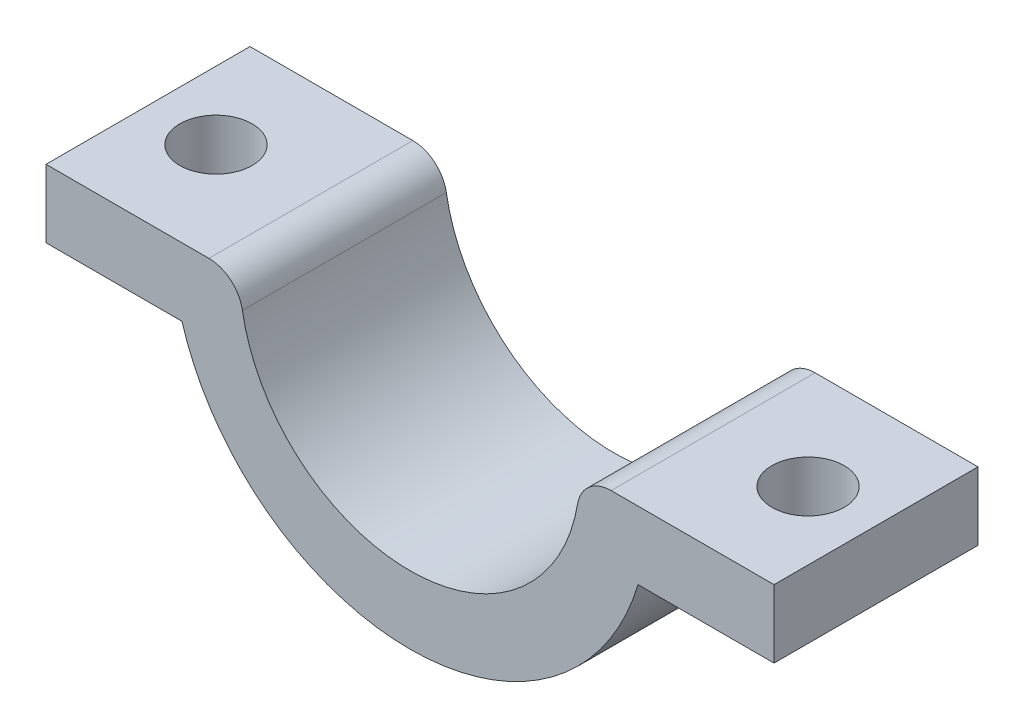
ISO-10303-21;
HEADER;
FILE_DESCRIPTION(('STEP AP214'),'2;1');
FILE_NAME('part.step','',(''),(''),'','','');
FILE_SCHEMA(('AUTOMOTIVE_DESIGN { 1 0 10303 214 1 1 1 1 }'));
ENDSEC;
DATA;
#1=APPLICATION_CONTEXT('core data for automotive mechanical design processes');
#2=APPLICATION_PROTOCOL_DEFINITION('international standard','automotive_design',2000,#1);
#3=PRODUCT_CONTEXT('',#1,'mechanical');
#4=PRODUCT('Part','Part','',(#3));
#5=PRODUCT_RELATED_PRODUCT_CATEGORY('part','',(#4));
#6=PRODUCT_DEFINITION_FORMATION('','',#4);
#7=PRODUCT_DEFINITION_CONTEXT('part definition',#1,'design');
#8=PRODUCT_DEFINITION('design','',#6,#7);
#9=PRODUCT_DEFINITION_SHAPE('','',#8);
#10=(LENGTH_UNIT() NAMED_UNIT(*) SI_UNIT(.MILLI.,.METRE.));
#11=(NAMED_UNIT(*) PLANE_ANGLE_UNIT() SI_UNIT($,.RADIAN.));
#12=(NAMED_UNIT(*) SI_UNIT($,.STERADIAN.) SOLID_ANGLE_UNIT());
#13=UNCERTAINTY_MEASURE_WITH_UNIT(LENGTH_MEASURE(1.E-05),#10,'distance_accuracy_value','');
#14=(GEOMETRIC_REPRESENTATION_CONTEXT(3) GLOBAL_UNCERTAINTY_ASSIGNED_CONTEXT((#13)) GLOBAL_UNIT_ASSIGNED_CONTEXT((#10,
#11,#12)) REPRESENTATION_CONTEXT('',''));
#15=CARTESIAN_POINT('',(0.,0.,0.));
#16=DIRECTION('',(0.,0.,1.));
#17=DIRECTION('',(1.,0.,0.));
#18=AXIS2_PLACEMENT_3D('',#15,#16,#17);
#19=CARTESIAN_POINT('',(0.,0.,19.05));
#20=DIRECTION('',(0.,0.,-1.));
#21=DIRECTION('',(-1.,0.,0.));
#22=AXIS2_PLACEMENT_3D('',#19,#20,#21);
#23=CYLINDRICAL_SURFACE('',#22,15.875);
#24=CARTESIAN_POINT('',(0.,0.,0.));
#25=DIRECTION('',(0.,0.,-1.));
#26=DIRECTION('',(-1.,0.,0.));
#27=AXIS2_PLACEMENT_3D('',#24,#25,#26);
#28=CIRCLE('',#27,15.875);
#29=CARTESIAN_POINT('',(15.6529610927844,-2.64583333333333,0.));
#30=VERTEX_POINT('',#29);
#31=CARTESIAN_POINT('',(-15.6529610927844,-2.64583333333333,0.));
#32=VERTEX_POINT('',#31);
#33=EDGE_CURVE('E150',#30,#32,#28,.T.);
#34=ORIENTED_EDGE('',*,*,#33,.T.);
#35=DIRECTION('',(0.,0.,-1.));
#36=VECTOR('',#35,1.);
#37=CARTESIAN_POINT('',(-15.6529610927844,-2.64583333333333,19.05));
#38=LINE('',#37,#36);
#39=CARTESIAN_POINT('',(-15.6529610927844,-2.64583333333333,19.05));
#40=VERTEX_POINT('',#39);
#41=EDGE_CURVE('E54',#32,#40,#38,.F.);
#42=ORIENTED_EDGE('',*,*,#41,.T.);
#43=CARTESIAN_POINT('',(0.,0.,19.05));
#44=DIRECTION('',(0.,0.,-1.));
#45=DIRECTION('',(-1.,0.,0.));
#46=AXIS2_PLACEMENT_3D('',#43,#44,#45);
#47=CIRCLE('',#46,15.875);
#48=CARTESIAN_POINT('',(15.6529610927844,-2.64583333333333,19.05));
#49=VERTEX_POINT('',#48);
#50=EDGE_CURVE('E121',#49,#40,#47,.T.);
#51=ORIENTED_EDGE('',*,*,#50,.F.);
#52=DIRECTION('',(0.,0.,-1.));
#53=VECTOR('',#52,1.);
#54=CARTESIAN_POINT('',(15.6529610927844,-2.64583333333333,19.05));
#55=LINE('',#54,#53);
#56=EDGE_CURVE('E183',#49,#30,#55,.T.);
#57=ORIENTED_EDGE('',*,*,#56,.T.);
#58=EDGE_LOOP('',(#34,#42,#51,#57));
#59=FACE_BOUND('',#58,.T.);
#60=ADVANCED_FACE('F33',(#59),#23,.F.);
#61=CARTESIAN_POINT('',(-15.875,0.,19.05));
#62=DIRECTION('',(0.,-1.,0.));
#63=DIRECTION('',(1.,0.,0.));
#64=AXIS2_PLACEMENT_3D('',#61,#62,#63);
#65=PLANE('',#64);
#66=CARTESIAN_POINT('',(-27.6485474856855,0.,9.525));
#67=DIRECTION('',(0.,-1.,0.));
#68=DIRECTION('',(0.,0.,-1.));
#69=AXIS2_PLACEMENT_3D('',#66,#67,#68);
#70=CIRCLE('',#69,3.3782);
#71=CARTESIAN_POINT('',(-27.6485474856855,0.,6.1468));
#72=VERTEX_POINT('',#71);
#73=EDGE_CURVE('E263',#72,#72,#70,.T.);
#74=ORIENTED_EDGE('',*,*,#73,.T.);
#75=EDGE_LOOP('',(#74));
#76=FACE_BOUND('',#75,.T.);
#77=DIRECTION('',(-1.,0.,0.));
#78=VECTOR('',#77,1.);
#79=CARTESIAN_POINT('',(-15.875,0.,19.05));
#80=LINE('',#79,#78);
#81=CARTESIAN_POINT('',(-18.7835533113413,0.,19.05));
#82=VERTEX_POINT('',#81);
#83=CARTESIAN_POINT('',(-33.9985474856855,0.,19.05));
#84=VERTEX_POINT('',#83);
#85=EDGE_CURVE('E111',#82,#84,#80,.T.);
#86=ORIENTED_EDGE('',*,*,#85,.F.);
#87=DIRECTION('',(0.,0.,-1.));
#88=VECTOR('',#87,1.);
#89=CARTESIAN_POINT('',(-18.7835533113413,0.,19.05));
#90=LINE('',#89,#88);
#91=CARTESIAN_POINT('',(-18.7835533113413,0.,0.));
#92=VERTEX_POINT('',#91);
#93=EDGE_CURVE('E130',#82,#92,#90,.T.);
#94=ORIENTED_EDGE('',*,*,#93,.T.);
#95=DIRECTION('',(-1.,0.,0.));
#96=VECTOR('',#95,1.);
#97=CARTESIAN_POINT('',(-15.875,0.,0.));
#98=LINE('',#97,#96);
#99=CARTESIAN_POINT('',(-33.9985474856855,0.,0.));
#100=VERTEX_POINT('',#99);
#101=EDGE_CURVE('E127',#92,#100,#98,.T.);
#102=ORIENTED_EDGE('',*,*,#101,.T.);
#103=DIRECTION('',(0.,0.,-1.));
#104=VECTOR('',#103,1.);
#105=CARTESIAN_POINT('',(-33.9985474856855,0.,19.05));
#106=LINE('',#105,#104);
#107=EDGE_CURVE('E124',#84,#100,#106,.T.);
#108=ORIENTED_EDGE('',*,*,#107,.F.);
#109=EDGE_LOOP('',(#86,#94,#102,#108));
#110=FACE_BOUND('',#109,.T.);
#111=ADVANCED_FACE('F125',(#76,#110),#65,.F.);
#112=CARTESIAN_POINT('',(-33.9985474856855,0.,19.05));
#113=DIRECTION('',(1.,0.,0.));
#114=DIRECTION('',(0.,0.,-1.));
#115=AXIS2_PLACEMENT_3D('',#112,#113,#114);
#116=PLANE('',#115);
#117=DIRECTION('',(0.,-1.,0.));
#118=VECTOR('',#117,1.);
#119=CARTESIAN_POINT('',(-33.9985474856855,0.,0.));
#120=LINE('',#119,#118);
#121=CARTESIAN_POINT('',(-33.9985474856855,-6.35,0.));
#122=VERTEX_POINT('',#121);
#123=EDGE_CURVE('E154',#100,#122,#120,.T.);
#124=ORIENTED_EDGE('',*,*,#123,.T.);
#125=DIRECTION('',(0.,0.,-1.));
#126=VECTOR('',#125,1.);
#127=CARTESIAN_POINT('',(-33.9985474856855,-6.35,19.05));
#128=LINE('',#127,#126);
#129=CARTESIAN_POINT('',(-33.9985474856855,-6.35,19.05));
#130=VERTEX_POINT('',#129);
#131=EDGE_CURVE('E131',#130,#122,#128,.T.);
#132=ORIENTED_EDGE('',*,*,#131,.F.);
#133=DIRECTION('',(0.,-1.,0.));
#134=VECTOR('',#133,1.);
#135=CARTESIAN_POINT('',(-33.9985474856855,0.,19.05));
#136=LINE('',#135,#134);
#137=EDGE_CURVE('E115',#84,#130,#136,.T.);
#138=ORIENTED_EDGE('',*,*,#137,.F.);
#139=ORIENTED_EDGE('',*,*,#107,.T.);
#140=EDGE_LOOP('',(#124,#132,#138,#139));
#141=FACE_BOUND('',#140,.T.);
#142=ADVANCED_FACE('F133',(#141),#116,.F.);
#143=CARTESIAN_POINT('',(-33.9985474856855,-6.35,19.05));
#144=DIRECTION('',(0.,1.,0.));
#145=DIRECTION('',(0.,0.,1.));
#146=AXIS2_PLACEMENT_3D('',#143,#144,#145);
#147=PLANE('',#146);
#148=CARTESIAN_POINT('',(-27.6485474856855,-6.35,9.525));
#149=DIRECTION('',(0.,-1.,0.));
#150=DIRECTION('',(0.,0.,-1.));
#151=AXIS2_PLACEMENT_3D('',#148,#149,#150);
#152=CIRCLE('',#151,3.3782);
#153=CARTESIAN_POINT('',(-27.6485474856855,-6.35,6.1468));
#154=VERTEX_POINT('',#153);
#155=EDGE_CURVE('E267',#154,#154,#152,.T.);
#156=ORIENTED_EDGE('',*,*,#155,.F.);
#157=EDGE_LOOP('',(#156));
#158=FACE_BOUND('',#157,.T.);
#159=DIRECTION('',(1.,0.,0.));
#160=VECTOR('',#159,1.);
#161=CARTESIAN_POINT('',(-33.9985474856855,-6.35,0.));
#162=LINE('',#161,#160);
#163=CARTESIAN_POINT('',(-21.2985474856855,-6.35,0.));
#164=VERTEX_POINT('',#163);
#165=EDGE_CURVE('E156',#122,#164,#162,.T.);
#166=ORIENTED_EDGE('',*,*,#165,.T.);
#167=DIRECTION('',(0.,0.,-1.));
#168=VECTOR('',#167,1.);
#169=CARTESIAN_POINT('',(-21.2985474856855,-6.35,19.05));
#170=LINE('',#169,#168);
#171=CARTESIAN_POINT('',(-21.2985474856855,-6.35,19.05));
#172=VERTEX_POINT('',#171);
#173=EDGE_CURVE('E174',#172,#164,#170,.T.);
#174=ORIENTED_EDGE('',*,*,#173,.F.);
#175=DIRECTION('',(1.,0.,0.));
#176=VECTOR('',#175,1.);
#177=CARTESIAN_POINT('',(-33.9985474856855,-6.35,19.05));
#178=LINE('',#177,#176);
#179=EDGE_CURVE('E136',#130,#172,#178,.T.);
#180=ORIENTED_EDGE('',*,*,#179,.F.);
#181=ORIENTED_EDGE('',*,*,#131,.T.);
#182=EDGE_LOOP('',(#166,#174,#180,#181));
#183=FACE_BOUND('',#182,.T.);
#184=ADVANCED_FACE('F214',(#158,#183),#147,.F.);
#185=CARTESIAN_POINT('',(0.,0.,19.05));
#186=DIRECTION('',(0.,0.,-1.));
#187=DIRECTION('',(-1.,0.,0.));
#188=AXIS2_PLACEMENT_3D('',#185,#186,#187);
#189=CYLINDRICAL_SURFACE('',#188,22.225);
#190=CARTESIAN_POINT('',(0.,0.,0.));
#191=DIRECTION('',(0.,0.,1.));
#192=DIRECTION('',(1.,0.,0.));
#193=AXIS2_PLACEMENT_3D('',#190,#191,#192);
#194=CIRCLE('',#193,22.225);
#195=CARTESIAN_POINT('',(21.2985474856855,-6.35000000000001,0.));
#196=VERTEX_POINT('',#195);
#197=EDGE_CURVE('E158',#164,#196,#194,.T.);
#198=ORIENTED_EDGE('',*,*,#197,.T.);
#199=DIRECTION('',(0.,0.,-1.));
#200=VECTOR('',#199,1.);
#201=CARTESIAN_POINT('',(21.2985474856855,-6.35000000000001,19.05));
#202=LINE('',#201,#200);
#203=CARTESIAN_POINT('',(21.2985474856855,-6.35000000000001,19.05));
#204=VERTEX_POINT('',#203);
#205=EDGE_CURVE('E171',#204,#196,#202,.T.);
#206=ORIENTED_EDGE('',*,*,#205,.F.);
#207=CARTESIAN_POINT('',(0.,0.,19.05));
#208=DIRECTION('',(0.,0.,1.));
#209=DIRECTION('',(1.,0.,0.));
#210=AXIS2_PLACEMENT_3D('',#207,#208,#209);
#211=CIRCLE('',#210,22.225);
#212=EDGE_CURVE('E138',#172,#204,#211,.T.);
#213=ORIENTED_EDGE('',*,*,#212,.F.);
#214=ORIENTED_EDGE('',*,*,#173,.T.);
#215=EDGE_LOOP('',(#198,#206,#213,#214));
#216=FACE_BOUND('',#215,.T.);
#217=ADVANCED_FACE('F211',(#216),#189,.T.);
#218=CARTESIAN_POINT('',(33.9985474856855,-6.35,19.05));
#219=DIRECTION('',(0.,1.,0.));
#220=DIRECTION('',(0.,0.,1.));
#221=AXIS2_PLACEMENT_3D('',#218,#219,#220);
#222=PLANE('',#221);
#223=CARTESIAN_POINT('',(27.6485474856855,-6.35,9.525));
#224=DIRECTION('',(0.,-1.,0.));
#225=DIRECTION('',(0.,0.,-1.));
#226=AXIS2_PLACEMENT_3D('',#223,#224,#225);
#227=CIRCLE('',#226,3.3782);
#228=CARTESIAN_POINT('',(27.6485474856855,-6.35,6.1468));
#229=VERTEX_POINT('',#228);
#230=EDGE_CURVE('E262',#229,#229,#227,.T.);
#231=ORIENTED_EDGE('',*,*,#230,.F.);
#232=EDGE_LOOP('',(#231));
#233=FACE_BOUND('',#232,.T.);
#234=DIRECTION('',(1.,0.,0.));
#235=VECTOR('',#234,1.);
#236=CARTESIAN_POINT('',(33.9985474856855,-6.35,0.));
#237=LINE('',#236,#235);
#238=CARTESIAN_POINT('',(33.9985474856855,-6.35,0.));
#239=VERTEX_POINT('',#238);
#240=EDGE_CURVE('E160',#196,#239,#237,.T.);
#241=ORIENTED_EDGE('',*,*,#240,.T.);
#242=DIRECTION('',(0.,0.,-1.));
#243=VECTOR('',#242,1.);
#244=CARTESIAN_POINT('',(33.9985474856855,-6.35,19.05));
#245=LINE('',#244,#243);
#246=CARTESIAN_POINT('',(33.9985474856855,-6.35,19.05));
#247=VERTEX_POINT('',#246);
#248=EDGE_CURVE('E168',#247,#239,#245,.T.);
#249=ORIENTED_EDGE('',*,*,#248,.F.);
#250=DIRECTION('',(1.,0.,0.));
#251=VECTOR('',#250,1.);
#252=CARTESIAN_POINT('',(33.9985474856855,-6.35,19.05));
#253=LINE('',#252,#251);
#254=EDGE_CURVE('E143',#204,#247,#253,.T.);
#255=ORIENTED_EDGE('',*,*,#254,.F.);
#256=ORIENTED_EDGE('',*,*,#205,.T.);
#257=EDGE_LOOP('',(#241,#249,#255,#256));
#258=FACE_BOUND('',#257,.T.);
#259=ADVANCED_FACE('F206',(#233,#258),#222,.F.);
#260=CARTESIAN_POINT('',(33.9985474856855,0.,19.05));
#261=DIRECTION('',(-1.,0.,0.));
#262=DIRECTION('',(0.,0.,1.));
#263=AXIS2_PLACEMENT_3D('',#260,#261,#262);
#264=PLANE('',#263);
#265=DIRECTION('',(0.,1.,0.));
#266=VECTOR('',#265,1.);
#267=CARTESIAN_POINT('',(33.9985474856855,0.,0.));
#268=LINE('',#267,#266);
#269=CARTESIAN_POINT('',(33.9985474856855,0.,0.));
#270=VERTEX_POINT('',#269);
#271=EDGE_CURVE('E162',#239,#270,#268,.T.);
#272=ORIENTED_EDGE('',*,*,#271,.T.);
#273=DIRECTION('',(0.,0.,-1.));
#274=VECTOR('',#273,1.);
#275=CARTESIAN_POINT('',(33.9985474856855,0.,19.05));
#276=LINE('',#275,#274);
#277=CARTESIAN_POINT('',(33.9985474856855,0.,19.05));
#278=VERTEX_POINT('',#277);
#279=EDGE_CURVE('E149',#278,#270,#276,.T.);
#280=ORIENTED_EDGE('',*,*,#279,.F.);
#281=DIRECTION('',(0.,1.,0.));
#282=VECTOR('',#281,1.);
#283=CARTESIAN_POINT('',(33.9985474856855,0.,19.05));
#284=LINE('',#283,#282);
#285=EDGE_CURVE('E145',#247,#278,#284,.T.);
#286=ORIENTED_EDGE('',*,*,#285,.F.);
#287=ORIENTED_EDGE('',*,*,#248,.T.);
#288=EDGE_LOOP('',(#272,#280,#286,#287));
#289=FACE_BOUND('',#288,.T.);
#290=ADVANCED_FACE('F200',(#289),#264,.F.);
#291=CARTESIAN_POINT('',(15.875,0.,19.05));
#292=DIRECTION('',(0.,-1.,0.));
#293=DIRECTION('',(1.,0.,0.));
#294=AXIS2_PLACEMENT_3D('',#291,#292,#293);
#295=PLANE('',#294);
#296=CARTESIAN_POINT('',(27.6485474856855,0.,9.525));
#297=DIRECTION('',(0.,-1.,0.));
#298=DIRECTION('',(0.,0.,-1.));
#299=AXIS2_PLACEMENT_3D('',#296,#297,#298);
#300=CIRCLE('',#299,3.3782);
#301=CARTESIAN_POINT('',(27.6485474856855,0.,6.1468));
#302=VERTEX_POINT('',#301);
#303=EDGE_CURVE('E152',#302,#302,#300,.T.);
#304=ORIENTED_EDGE('',*,*,#303,.T.);
#305=EDGE_LOOP('',(#304));
#306=FACE_BOUND('',#305,.T.);
#307=DIRECTION('',(-1.,0.,0.));
#308=VECTOR('',#307,1.);
#309=CARTESIAN_POINT('',(15.875,0.,0.));
#310=LINE('',#309,#308);
#311=CARTESIAN_POINT('',(18.7835533113413,0.,0.));
#312=VERTEX_POINT('',#311);
#313=EDGE_CURVE('E164',#270,#312,#310,.T.);
#314=ORIENTED_EDGE('',*,*,#313,.T.);
#315=DIRECTION('',(0.,0.,-1.));
#316=VECTOR('',#315,1.);
#317=CARTESIAN_POINT('',(18.7835533113413,0.,19.05));
#318=LINE('',#317,#316);
#319=CARTESIAN_POINT('',(18.7835533113413,0.,19.05));
#320=VERTEX_POINT('',#319);
#321=EDGE_CURVE('E11',#312,#320,#318,.F.);
#322=ORIENTED_EDGE('',*,*,#321,.T.);
#323=DIRECTION('',(-1.,0.,0.));
#324=VECTOR('',#323,1.);
#325=CARTESIAN_POINT('',(15.875,0.,19.05));
#326=LINE('',#325,#324);
#327=EDGE_CURVE('E147',#278,#320,#326,.T.);
#328=ORIENTED_EDGE('',*,*,#327,.F.);
#329=ORIENTED_EDGE('',*,*,#279,.T.);
#330=EDGE_LOOP('',(#314,#322,#328,#329));
#331=FACE_BOUND('',#330,.T.);
#332=ADVANCED_FACE('F196',(#306,#331),#295,.F.);
#333=CARTESIAN_POINT('',(0.,0.,19.05));
#334=DIRECTION('',(0.,0.,-1.));
#335=DIRECTION('',(-1.,0.,0.));
#336=AXIS2_PLACEMENT_3D('',#333,#334,#335);
#337=PLANE('',#336);
#338=ORIENTED_EDGE('',*,*,#50,.T.);
#339=CARTESIAN_POINT('',(-18.7835533113413,-3.175,19.05));
#340=DIRECTION('',(0.,0.,-1.));
#341=DIRECTION('',(-1.,0.,0.));
#342=AXIS2_PLACEMENT_3D('',#339,#340,#341);
#343=CIRCLE('',#342,3.175);
#344=EDGE_CURVE('E41',#40,#82,#343,.F.);
#345=ORIENTED_EDGE('',*,*,#344,.T.);
#346=ORIENTED_EDGE('',*,*,#85,.T.);
#347=ORIENTED_EDGE('',*,*,#137,.T.);
#348=ORIENTED_EDGE('',*,*,#179,.T.);
#349=ORIENTED_EDGE('',*,*,#212,.T.);
#350=ORIENTED_EDGE('',*,*,#254,.T.);
#351=ORIENTED_EDGE('',*,*,#285,.T.);
#352=ORIENTED_EDGE('',*,*,#327,.T.);
#353=CARTESIAN_POINT('',(18.7835533113413,-3.175,19.05));
#354=DIRECTION('',(0.,0.,-1.));
#355=DIRECTION('',(-1.,0.,0.));
#356=AXIS2_PLACEMENT_3D('',#353,#354,#355);
#357=CIRCLE('',#356,3.175);
#358=EDGE_CURVE('E187',#320,#49,#357,.F.);
#359=ORIENTED_EDGE('',*,*,#358,.T.);
#360=EDGE_LOOP('',(#338,#345,#346,#347,#348,#349,#350,#351,#352,#359));
#361=FACE_BOUND('',#360,.T.);
#362=ADVANCED_FACE('F113',(#361),#337,.F.);
#363=CARTESIAN_POINT('',(0.,0.,0.));
#364=DIRECTION('',(0.,0.,-1.));
#365=DIRECTION('',(-1.,0.,0.));
#366=AXIS2_PLACEMENT_3D('',#363,#364,#365);
#367=PLANE('',#366);
#368=ORIENTED_EDGE('',*,*,#101,.F.);
#369=CARTESIAN_POINT('',(-18.7835533113413,-3.175,0.));
#370=DIRECTION('',(0.,0.,-1.));
#371=DIRECTION('',(-1.,0.,0.));
#372=AXIS2_PLACEMENT_3D('',#369,#370,#371);
#373=CIRCLE('',#372,3.175);
#374=EDGE_CURVE('E181',#92,#32,#373,.T.);
#375=ORIENTED_EDGE('',*,*,#374,.T.);
#376=ORIENTED_EDGE('',*,*,#33,.F.);
#377=CARTESIAN_POINT('',(18.7835533113413,-3.175,0.));
#378=DIRECTION('',(0.,0.,-1.));
#379=DIRECTION('',(-1.,0.,0.));
#380=AXIS2_PLACEMENT_3D('',#377,#378,#379);
#381=CIRCLE('',#380,3.175);
#382=EDGE_CURVE('E179',#30,#312,#381,.T.);
#383=ORIENTED_EDGE('',*,*,#382,.T.);
#384=ORIENTED_EDGE('',*,*,#313,.F.);
#385=ORIENTED_EDGE('',*,*,#271,.F.);
#386=ORIENTED_EDGE('',*,*,#240,.F.);
#387=ORIENTED_EDGE('',*,*,#197,.F.);
#388=ORIENTED_EDGE('',*,*,#165,.F.);
#389=ORIENTED_EDGE('',*,*,#123,.F.);
#390=EDGE_LOOP('',(#368,#375,#376,#383,#384,#385,#386,#387,#388,#389));
#391=FACE_BOUND('',#390,.T.);
#392=ADVANCED_FACE('F194',(#391),#367,.T.);
#393=CARTESIAN_POINT('',(27.6485474856855,0.,9.525));
#394=DIRECTION('',(0.,-1.,0.));
#395=DIRECTION('',(0.,0.,-1.));
#396=AXIS2_PLACEMENT_3D('',#393,#394,#395);
#397=CYLINDRICAL_SURFACE('',#396,3.3782);
#398=ORIENTED_EDGE('',*,*,#303,.F.);
#399=EDGE_LOOP('',(#398));
#400=FACE_BOUND('',#399,.T.);
#401=ORIENTED_EDGE('',*,*,#230,.T.);
#402=EDGE_LOOP('',(#401));
#403=FACE_BOUND('',#402,.T.);
#404=ADVANCED_FACE('F223',(#400,#403),#397,.F.);
#405=CARTESIAN_POINT('',(-27.6485474856855,0.,9.525));
#406=DIRECTION('',(0.,-1.,0.));
#407=DIRECTION('',(0.,0.,-1.));
#408=AXIS2_PLACEMENT_3D('',#405,#406,#407);
#409=CYLINDRICAL_SURFACE('',#408,3.3782);
#410=ORIENTED_EDGE('',*,*,#73,.F.);
#411=EDGE_LOOP('',(#410));
#412=FACE_BOUND('',#411,.T.);
#413=ORIENTED_EDGE('',*,*,#155,.T.);
#414=EDGE_LOOP('',(#413));
#415=FACE_BOUND('',#414,.T.);
#416=ADVANCED_FACE('F218',(#412,#415),#409,.F.);
#417=CARTESIAN_POINT('',(-18.7835533113413,-3.175,19.05));
#418=DIRECTION('',(0.,0.,-1.));
#419=DIRECTION('',(-1.,0.,0.));
#420=AXIS2_PLACEMENT_3D('',#417,#418,#419);
#421=CYLINDRICAL_SURFACE('',#420,3.175);
#422=ORIENTED_EDGE('',*,*,#344,.F.);
#423=ORIENTED_EDGE('',*,*,#41,.F.);
#424=ORIENTED_EDGE('',*,*,#374,.F.);
#425=ORIENTED_EDGE('',*,*,#93,.F.);
#426=EDGE_LOOP('',(#422,#423,#424,#425));
#427=FACE_BOUND('',#426,.T.);
#428=ADVANCED_FACE('F216',(#427),#421,.T.);
#429=CARTESIAN_POINT('',(18.7835533113413,-3.175,19.05));
#430=DIRECTION('',(0.,0.,-1.));
#431=DIRECTION('',(-1.,0.,0.));
#432=AXIS2_PLACEMENT_3D('',#429,#430,#431);
#433=CYLINDRICAL_SURFACE('',#432,3.175);
#434=ORIENTED_EDGE('',*,*,#358,.F.);
#435=ORIENTED_EDGE('',*,*,#321,.F.);
#436=ORIENTED_EDGE('',*,*,#382,.F.);
#437=ORIENTED_EDGE('',*,*,#56,.F.);
#438=EDGE_LOOP('',(#434,#435,#436,#437));
#439=FACE_BOUND('',#438,.T.);
#440=ADVANCED_FACE('F35',(#439),#433,.T.);
#441=CLOSED_SHELL('',(#60,#111,#142,#184,#217,#259,#290,#332,#362,#392,#404,#416,#428,#440));
#442=MANIFOLD_SOLID_BREP('B2',#441);
#443=ADVANCED_BREP_SHAPE_REPRESENTATION('',(#18,#442),#14);
#444=SHAPE_DEFINITION_REPRESENTATION(#9,#443);
ENDSEC;
END-ISO-10303-21;
